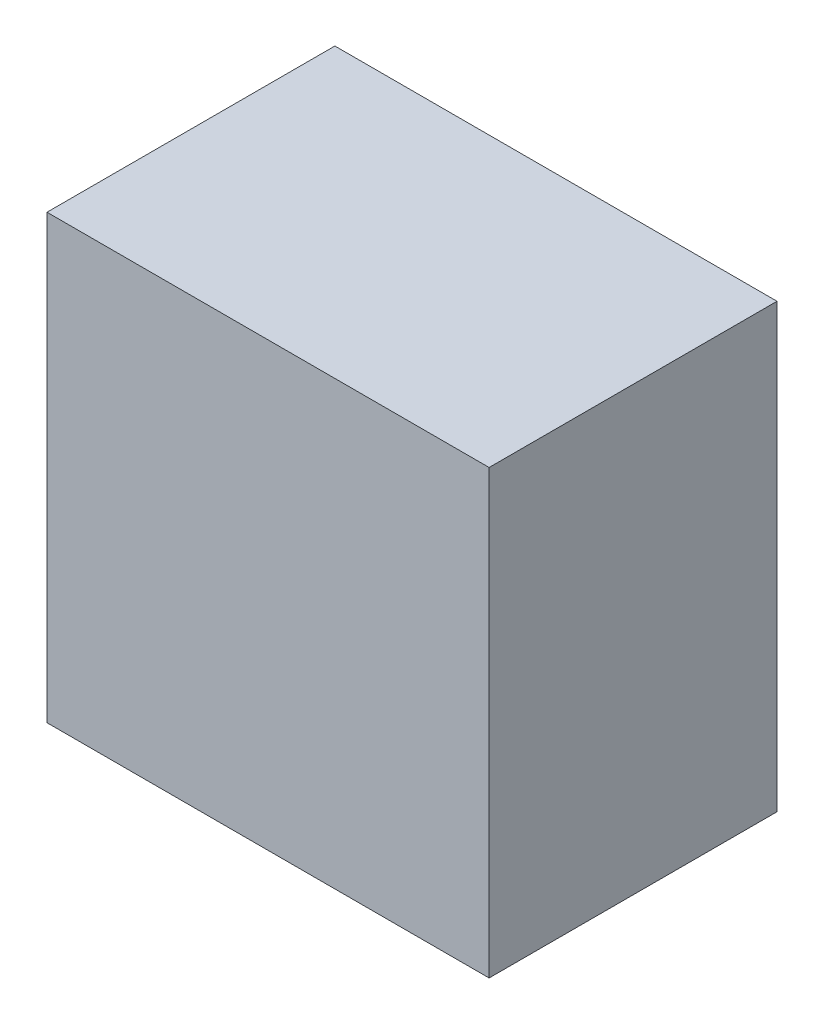
ISO-10303-21;
HEADER;
FILE_DESCRIPTION(('STEP AP214'),'2;1');
FILE_NAME('part.step','',(''),(''),'','','');
FILE_SCHEMA(('AUTOMOTIVE_DESIGN { 1 0 10303 214 1 1 1 1 }'));
ENDSEC;
DATA;
#1=APPLICATION_CONTEXT('core data for automotive mechanical design processes');
#2=APPLICATION_PROTOCOL_DEFINITION('international standard','automotive_design',2000,#1);
#3=PRODUCT_CONTEXT('',#1,'mechanical');
#4=PRODUCT('Part','Part','',(#3));
#5=PRODUCT_RELATED_PRODUCT_CATEGORY('part','',(#4));
#6=PRODUCT_DEFINITION_FORMATION('','',#4);
#7=PRODUCT_DEFINITION_CONTEXT('part definition',#1,'design');
#8=PRODUCT_DEFINITION('design','',#6,#7);
#9=PRODUCT_DEFINITION_SHAPE('','',#8);
#10=(LENGTH_UNIT() NAMED_UNIT(*) SI_UNIT(.MILLI.,.METRE.));
#11=(NAMED_UNIT(*) PLANE_ANGLE_UNIT() SI_UNIT($,.RADIAN.));
#12=(NAMED_UNIT(*) SI_UNIT($,.STERADIAN.) SOLID_ANGLE_UNIT());
#13=UNCERTAINTY_MEASURE_WITH_UNIT(LENGTH_MEASURE(1.E-05),#10,'distance_accuracy_value','');
#14=(GEOMETRIC_REPRESENTATION_CONTEXT(3) GLOBAL_UNCERTAINTY_ASSIGNED_CONTEXT((#13)) GLOBAL_UNIT_ASSIGNED_CONTEXT((#10,
#11,#12)) REPRESENTATION_CONTEXT('',''));
#15=CARTESIAN_POINT('',(0.,0.,0.));
#16=DIRECTION('',(0.,0.,1.));
#17=DIRECTION('',(1.,0.,0.));
#18=AXIS2_PLACEMENT_3D('',#15,#16,#17);
#19=CARTESIAN_POINT('',(-21.5,21.5,28.));
#20=DIRECTION('',(1.,0.,0.));
#21=DIRECTION('',(0.,1.,0.));
#22=AXIS2_PLACEMENT_3D('',#19,#20,#21);
#23=PLANE('',#22);
#24=DIRECTION('',(0.,-1.,0.));
#25=VECTOR('',#24,1.);
#26=CARTESIAN_POINT('',(-21.5,21.5,0.));
#27=LINE('',#26,#25);
#28=CARTESIAN_POINT('',(-21.5,21.5,0.));
#29=VERTEX_POINT('',#28);
#30=CARTESIAN_POINT('',(-21.5,-21.5,0.));
#31=VERTEX_POINT('',#30);
#32=EDGE_CURVE('E96',#29,#31,#27,.T.);
#33=ORIENTED_EDGE('',*,*,#32,.T.);
#34=DIRECTION('',(0.,0.,-1.));
#35=VECTOR('',#34,1.);
#36=CARTESIAN_POINT('',(-21.5,-21.5,28.));
#37=LINE('',#36,#35);
#38=CARTESIAN_POINT('',(-21.5,-21.5,28.));
#39=VERTEX_POINT('',#38);
#40=EDGE_CURVE('E11',#39,#31,#37,.T.);
#41=ORIENTED_EDGE('',*,*,#40,.F.);
#42=DIRECTION('',(0.,-1.,0.));
#43=VECTOR('',#42,1.);
#44=CARTESIAN_POINT('',(-21.5,21.5,28.));
#45=LINE('',#44,#43);
#46=CARTESIAN_POINT('',(-21.5,21.5,28.));
#47=VERTEX_POINT('',#46);
#48=EDGE_CURVE('E84',#47,#39,#45,.T.);
#49=ORIENTED_EDGE('',*,*,#48,.F.);
#50=DIRECTION('',(0.,0.,-1.));
#51=VECTOR('',#50,1.);
#52=CARTESIAN_POINT('',(-21.5,21.5,28.));
#53=LINE('',#52,#51);
#54=EDGE_CURVE('E92',#47,#29,#53,.T.);
#55=ORIENTED_EDGE('',*,*,#54,.T.);
#56=EDGE_LOOP('',(#33,#41,#49,#55));
#57=FACE_BOUND('',#56,.T.);
#58=ADVANCED_FACE('F33',(#57),#23,.F.);
#59=CARTESIAN_POINT('',(21.5,-21.5,28.));
#60=DIRECTION('',(0.,1.,0.));
#61=DIRECTION('',(-1.,0.,0.));
#62=AXIS2_PLACEMENT_3D('',#59,#60,#61);
#63=PLANE('',#62);
#64=DIRECTION('',(1.,0.,0.));
#65=VECTOR('',#64,1.);
#66=CARTESIAN_POINT('',(21.5,-21.5,0.));
#67=LINE('',#66,#65);
#68=CARTESIAN_POINT('',(21.5,-21.5,0.));
#69=VERTEX_POINT('',#68);
#70=EDGE_CURVE('E88',#31,#69,#67,.T.);
#71=ORIENTED_EDGE('',*,*,#70,.T.);
#72=DIRECTION('',(0.,0.,-1.));
#73=VECTOR('',#72,1.);
#74=CARTESIAN_POINT('',(21.5,-21.5,28.));
#75=LINE('',#74,#73);
#76=CARTESIAN_POINT('',(21.5,-21.5,28.));
#77=VERTEX_POINT('',#76);
#78=EDGE_CURVE('E41',#77,#69,#75,.T.);
#79=ORIENTED_EDGE('',*,*,#78,.F.);
#80=DIRECTION('',(1.,0.,0.));
#81=VECTOR('',#80,1.);
#82=CARTESIAN_POINT('',(21.5,-21.5,28.));
#83=LINE('',#82,#81);
#84=EDGE_CURVE('E79',#39,#77,#83,.T.);
#85=ORIENTED_EDGE('',*,*,#84,.F.);
#86=ORIENTED_EDGE('',*,*,#40,.T.);
#87=EDGE_LOOP('',(#71,#79,#85,#86));
#88=FACE_BOUND('',#87,.T.);
#89=ADVANCED_FACE('F87',(#88),#63,.F.);
#90=CARTESIAN_POINT('',(21.5,21.5,28.));
#91=DIRECTION('',(-1.,0.,0.));
#92=DIRECTION('',(0.,-1.,0.));
#93=AXIS2_PLACEMENT_3D('',#90,#91,#92);
#94=PLANE('',#93);
#95=DIRECTION('',(0.,1.,0.));
#96=VECTOR('',#95,1.);
#97=CARTESIAN_POINT('',(21.5,21.5,0.));
#98=LINE('',#97,#96);
#99=CARTESIAN_POINT('',(21.5,21.5,0.));
#100=VERTEX_POINT('',#99);
#101=EDGE_CURVE('E66',#69,#100,#98,.T.);
#102=ORIENTED_EDGE('',*,*,#101,.T.);
#103=DIRECTION('',(0.,0.,-1.));
#104=VECTOR('',#103,1.);
#105=CARTESIAN_POINT('',(21.5,21.5,28.));
#106=LINE('',#105,#104);
#107=CARTESIAN_POINT('',(21.5,21.5,28.));
#108=VERTEX_POINT('',#107);
#109=EDGE_CURVE('E89',#108,#100,#106,.T.);
#110=ORIENTED_EDGE('',*,*,#109,.F.);
#111=DIRECTION('',(0.,1.,0.));
#112=VECTOR('',#111,1.);
#113=CARTESIAN_POINT('',(21.5,21.5,28.));
#114=LINE('',#113,#112);
#115=EDGE_CURVE('E82',#77,#108,#114,.T.);
#116=ORIENTED_EDGE('',*,*,#115,.F.);
#117=ORIENTED_EDGE('',*,*,#78,.T.);
#118=EDGE_LOOP('',(#102,#110,#116,#117));
#119=FACE_BOUND('',#118,.T.);
#120=ADVANCED_FACE('F90',(#119),#94,.F.);
#121=CARTESIAN_POINT('',(21.5,21.5,28.));
#122=DIRECTION('',(0.,-1.,0.));
#123=DIRECTION('',(1.,0.,0.));
#124=AXIS2_PLACEMENT_3D('',#121,#122,#123);
#125=PLANE('',#124);
#126=DIRECTION('',(-1.,0.,0.));
#127=VECTOR('',#126,1.);
#128=CARTESIAN_POINT('',(21.5,21.5,0.));
#129=LINE('',#128,#127);
#130=EDGE_CURVE('E72',#100,#29,#129,.T.);
#131=ORIENTED_EDGE('',*,*,#130,.T.);
#132=ORIENTED_EDGE('',*,*,#54,.F.);
#133=DIRECTION('',(-1.,0.,0.));
#134=VECTOR('',#133,1.);
#135=CARTESIAN_POINT('',(21.5,21.5,28.));
#136=LINE('',#135,#134);
#137=EDGE_CURVE('E49',#108,#47,#136,.T.);
#138=ORIENTED_EDGE('',*,*,#137,.F.);
#139=ORIENTED_EDGE('',*,*,#109,.T.);
#140=EDGE_LOOP('',(#131,#132,#138,#139));
#141=FACE_BOUND('',#140,.T.);
#142=ADVANCED_FACE('F104',(#141),#125,.F.);
#143=CARTESIAN_POINT('',(0.,0.,28.));
#144=DIRECTION('',(0.,0.,-1.));
#145=DIRECTION('',(-1.,0.,0.));
#146=AXIS2_PLACEMENT_3D('',#143,#144,#145);
#147=PLANE('',#146);
#148=ORIENTED_EDGE('',*,*,#48,.T.);
#149=ORIENTED_EDGE('',*,*,#84,.T.);
#150=ORIENTED_EDGE('',*,*,#115,.T.);
#151=ORIENTED_EDGE('',*,*,#137,.T.);
#152=EDGE_LOOP('',(#148,#149,#150,#151));
#153=FACE_BOUND('',#152,.T.);
#154=ADVANCED_FACE('F80',(#153),#147,.F.);
#155=CARTESIAN_POINT('',(0.,0.,0.));
#156=DIRECTION('',(0.,0.,-1.));
#157=DIRECTION('',(-1.,0.,0.));
#158=AXIS2_PLACEMENT_3D('',#155,#156,#157);
#159=PLANE('',#158);
#160=CARTESIAN_POINT('',(0.,0.,0.));
#161=DIRECTION('',(0.,0.,-1.));
#162=DIRECTION('',(-1.,0.,0.));
#163=AXIS2_PLACEMENT_3D('',#160,#161,#162);
#164=CIRCLE('',#163,4.05);
#165=CARTESIAN_POINT('',(-4.05,0.,0.));
#166=VERTEX_POINT('',#165);
#167=EDGE_CURVE('E110',#166,#166,#164,.T.);
#168=ORIENTED_EDGE('',*,*,#167,.F.);
#169=EDGE_LOOP('',(#168));
#170=FACE_BOUND('',#169,.T.);
#171=ORIENTED_EDGE('',*,*,#32,.F.);
#172=ORIENTED_EDGE('',*,*,#130,.F.);
#173=ORIENTED_EDGE('',*,*,#101,.F.);
#174=ORIENTED_EDGE('',*,*,#70,.F.);
#175=EDGE_LOOP('',(#171,#172,#173,#174));
#176=FACE_BOUND('',#175,.T.);
#177=ADVANCED_FACE('F107',(#170,#176),#159,.T.);
#178=CARTESIAN_POINT('',(0.,0.,12.));
#179=DIRECTION('',(0.,0.,-1.));
#180=DIRECTION('',(-1.,0.,0.));
#181=AXIS2_PLACEMENT_3D('',#178,#179,#180);
#182=CYLINDRICAL_SURFACE('',#181,4.05);
#183=CARTESIAN_POINT('',(0.,0.,12.));
#184=DIRECTION('',(0.,0.,-1.));
#185=DIRECTION('',(-1.,0.,0.));
#186=AXIS2_PLACEMENT_3D('',#183,#184,#185);
#187=CIRCLE('',#186,4.05);
#188=CARTESIAN_POINT('',(-4.05,0.,12.));
#189=VERTEX_POINT('',#188);
#190=EDGE_CURVE('E99',#189,#189,#187,.T.);
#191=ORIENTED_EDGE('',*,*,#190,.F.);
#192=EDGE_LOOP('',(#191));
#193=FACE_BOUND('',#192,.T.);
#194=ORIENTED_EDGE('',*,*,#167,.T.);
#195=EDGE_LOOP('',(#194));
#196=FACE_BOUND('',#195,.T.);
#197=ADVANCED_FACE('F118',(#193,#196),#182,.F.);
#198=CARTESIAN_POINT('',(0.,0.,12.));
#199=DIRECTION('',(0.,0.,-1.));
#200=DIRECTION('',(-1.,0.,0.));
#201=AXIS2_PLACEMENT_3D('',#198,#199,#200);
#202=PLANE('',#201);
#203=ORIENTED_EDGE('',*,*,#190,.T.);
#204=EDGE_LOOP('',(#203));
#205=FACE_BOUND('',#204,.T.);
#206=ADVANCED_FACE('F116',(#205),#202,.T.);
#207=CLOSED_SHELL('',(#58,#89,#120,#142,#154,#177,#197,#206));
#208=MANIFOLD_SOLID_BREP('B2',#207);
#209=ADVANCED_BREP_SHAPE_REPRESENTATION('',(#18,#208),#14);
#210=SHAPE_DEFINITION_REPRESENTATION(#9,#209);
ENDSEC;
END-ISO-10303-21;
